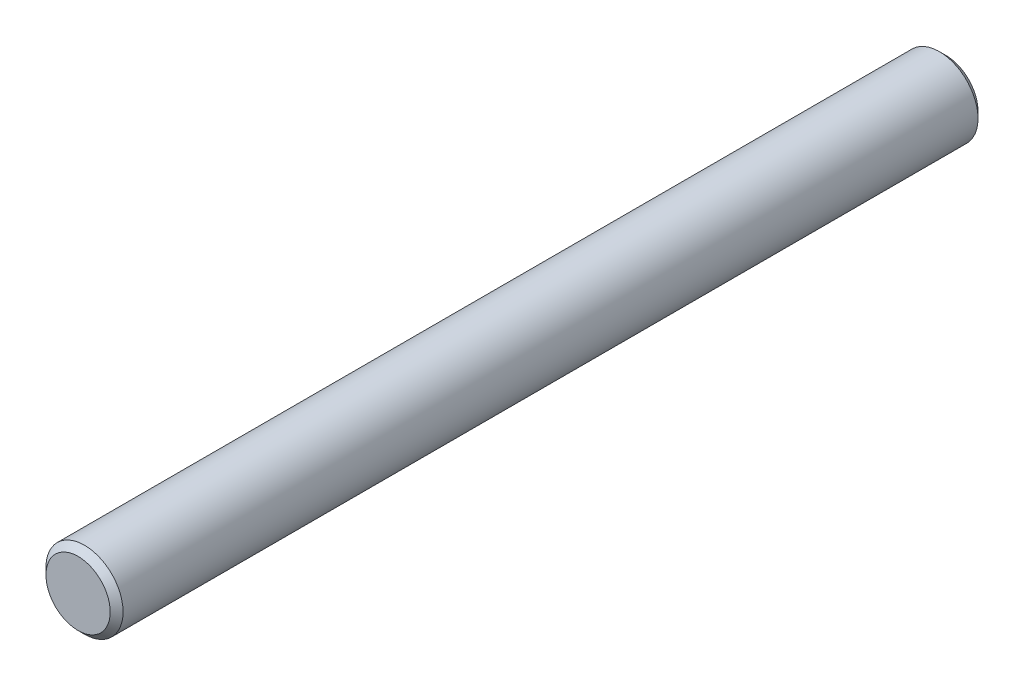
ISO-10303-21;
HEADER;
FILE_DESCRIPTION(('STEP AP214'),'2;1');
FILE_NAME('part.step','',(''),(''),'','','');
FILE_SCHEMA(('AUTOMOTIVE_DESIGN { 1 0 10303 214 1 1 1 1 }'));
ENDSEC;
DATA;
#1=APPLICATION_CONTEXT('core data for automotive mechanical design processes');
#2=APPLICATION_PROTOCOL_DEFINITION('international standard','automotive_design',2000,#1);
#3=PRODUCT_CONTEXT('',#1,'mechanical');
#4=PRODUCT('Part','Part','',(#3));
#5=PRODUCT_RELATED_PRODUCT_CATEGORY('part','',(#4));
#6=PRODUCT_DEFINITION_FORMATION('','',#4);
#7=PRODUCT_DEFINITION_CONTEXT('part definition',#1,'design');
#8=PRODUCT_DEFINITION('design','',#6,#7);
#9=PRODUCT_DEFINITION_SHAPE('','',#8);
#10=(LENGTH_UNIT() NAMED_UNIT(*) SI_UNIT(.MILLI.,.METRE.));
#11=(NAMED_UNIT(*) PLANE_ANGLE_UNIT() SI_UNIT($,.RADIAN.));
#12=(NAMED_UNIT(*) SI_UNIT($,.STERADIAN.) SOLID_ANGLE_UNIT());
#13=UNCERTAINTY_MEASURE_WITH_UNIT(LENGTH_MEASURE(1.E-05),#10,'distance_accuracy_value','');
#14=(GEOMETRIC_REPRESENTATION_CONTEXT(3) GLOBAL_UNCERTAINTY_ASSIGNED_CONTEXT((#13)) GLOBAL_UNIT_ASSIGNED_CONTEXT((#10,
#11,#12)) REPRESENTATION_CONTEXT('',''));
#15=CARTESIAN_POINT('',(0.,0.,0.));
#16=DIRECTION('',(0.,0.,1.));
#17=DIRECTION('',(1.,0.,0.));
#18=AXIS2_PLACEMENT_3D('',#15,#16,#17);
#19=CARTESIAN_POINT('',(0.,0.,67.5));
#20=DIRECTION('',(0.,0.,-1.));
#21=DIRECTION('',(-1.,0.,0.));
#22=AXIS2_PLACEMENT_3D('',#19,#20,#21);
#23=CYLINDRICAL_SURFACE('',#22,6.);
#24=CARTESIAN_POINT('',(0.,0.,-66.5));
#25=DIRECTION('',(0.,0.,1.));
#26=DIRECTION('',(1.,0.,0.));
#27=AXIS2_PLACEMENT_3D('',#24,#25,#26);
#28=CIRCLE('',#27,6.);
#29=CARTESIAN_POINT('',(6.,0.,-66.5));
#30=VERTEX_POINT('',#29);
#31=EDGE_CURVE('E53',#30,#30,#28,.T.);
#32=ORIENTED_EDGE('',*,*,#31,.T.);
#33=EDGE_LOOP('',(#32));
#34=FACE_BOUND('',#33,.T.);
#35=CARTESIAN_POINT('',(0.,0.,66.5));
#36=DIRECTION('',(0.,0.,1.));
#37=DIRECTION('',(1.,0.,0.));
#38=AXIS2_PLACEMENT_3D('',#35,#36,#37);
#39=CIRCLE('',#38,6.);
#40=CARTESIAN_POINT('',(6.,0.,66.5));
#41=VERTEX_POINT('',#40);
#42=EDGE_CURVE('E57',#41,#41,#39,.F.);
#43=ORIENTED_EDGE('',*,*,#42,.T.);
#44=EDGE_LOOP('',(#43));
#45=FACE_BOUND('',#44,.T.);
#46=ADVANCED_FACE('F41',(#34,#45),#23,.T.);
#47=CARTESIAN_POINT('',(0.,0.,67.5));
#48=DIRECTION('',(0.,0.,1.));
#49=DIRECTION('',(1.,0.,0.));
#50=AXIS2_PLACEMENT_3D('',#47,#48,#49);
#51=PLANE('',#50);
#52=CARTESIAN_POINT('',(0.,0.,67.5));
#53=DIRECTION('',(0.,0.,1.));
#54=DIRECTION('',(1.,0.,0.));
#55=AXIS2_PLACEMENT_3D('',#52,#53,#54);
#56=CIRCLE('',#55,4.99999999999999);
#57=CARTESIAN_POINT('',(4.99999999999999,0.,67.5));
#58=VERTEX_POINT('',#57);
#59=EDGE_CURVE('E10',#58,#58,#56,.T.);
#60=ORIENTED_EDGE('',*,*,#59,.T.);
#61=EDGE_LOOP('',(#60));
#62=FACE_BOUND('',#61,.T.);
#63=ADVANCED_FACE('F73',(#62),#51,.T.);
#64=CARTESIAN_POINT('',(0.,0.,-67.5));
#65=DIRECTION('',(0.,0.,1.));
#66=DIRECTION('',(1.,0.,0.));
#67=AXIS2_PLACEMENT_3D('',#64,#65,#66);
#68=PLANE('',#67);
#69=CARTESIAN_POINT('',(0.,0.,-67.5));
#70=DIRECTION('',(0.,0.,1.));
#71=DIRECTION('',(1.,0.,0.));
#72=AXIS2_PLACEMENT_3D('',#69,#70,#71);
#73=CIRCLE('',#72,4.99999999999999);
#74=CARTESIAN_POINT('',(4.99999999999999,0.,-67.5));
#75=VERTEX_POINT('',#74);
#76=EDGE_CURVE('E49',#75,#75,#73,.F.);
#77=ORIENTED_EDGE('',*,*,#76,.T.);
#78=EDGE_LOOP('',(#77));
#79=FACE_BOUND('',#78,.T.);
#80=ADVANCED_FACE('F70',(#79),#68,.F.);
#81=CARTESIAN_POINT('',(0.,0.,-66.5));
#82=DIRECTION('',(0.,0.,1.));
#83=DIRECTION('',(1.,0.,0.));
#84=AXIS2_PLACEMENT_3D('',#81,#82,#83);
#85=CONICAL_SURFACE('',#84,6.,0.785398163397453);
#86=ORIENTED_EDGE('',*,*,#76,.F.);
#87=EDGE_LOOP('',(#86));
#88=FACE_BOUND('',#87,.T.);
#89=ORIENTED_EDGE('',*,*,#31,.F.);
#90=EDGE_LOOP('',(#89));
#91=FACE_BOUND('',#90,.T.);
#92=ADVANCED_FACE('F66',(#88,#91),#85,.T.);
#93=CARTESIAN_POINT('',(0.,0.,67.5));
#94=DIRECTION('',(0.,0.,-1.));
#95=DIRECTION('',(-1.,0.,0.));
#96=AXIS2_PLACEMENT_3D('',#93,#94,#95);
#97=CONICAL_SURFACE('',#96,4.99999999999999,0.785398163397446);
#98=ORIENTED_EDGE('',*,*,#42,.F.);
#99=EDGE_LOOP('',(#98));
#100=FACE_BOUND('',#99,.T.);
#101=ORIENTED_EDGE('',*,*,#59,.F.);
#102=EDGE_LOOP('',(#101));
#103=FACE_BOUND('',#102,.T.);
#104=ADVANCED_FACE('F44',(#100,#103),#97,.T.);
#105=CLOSED_SHELL('',(#46,#63,#80,#92,#104));
#106=MANIFOLD_SOLID_BREP('B2',#105);
#107=ADVANCED_BREP_SHAPE_REPRESENTATION('',(#18,#106),#14);
#108=SHAPE_DEFINITION_REPRESENTATION(#9,#107);
ENDSEC;
END-ISO-10303-21;
